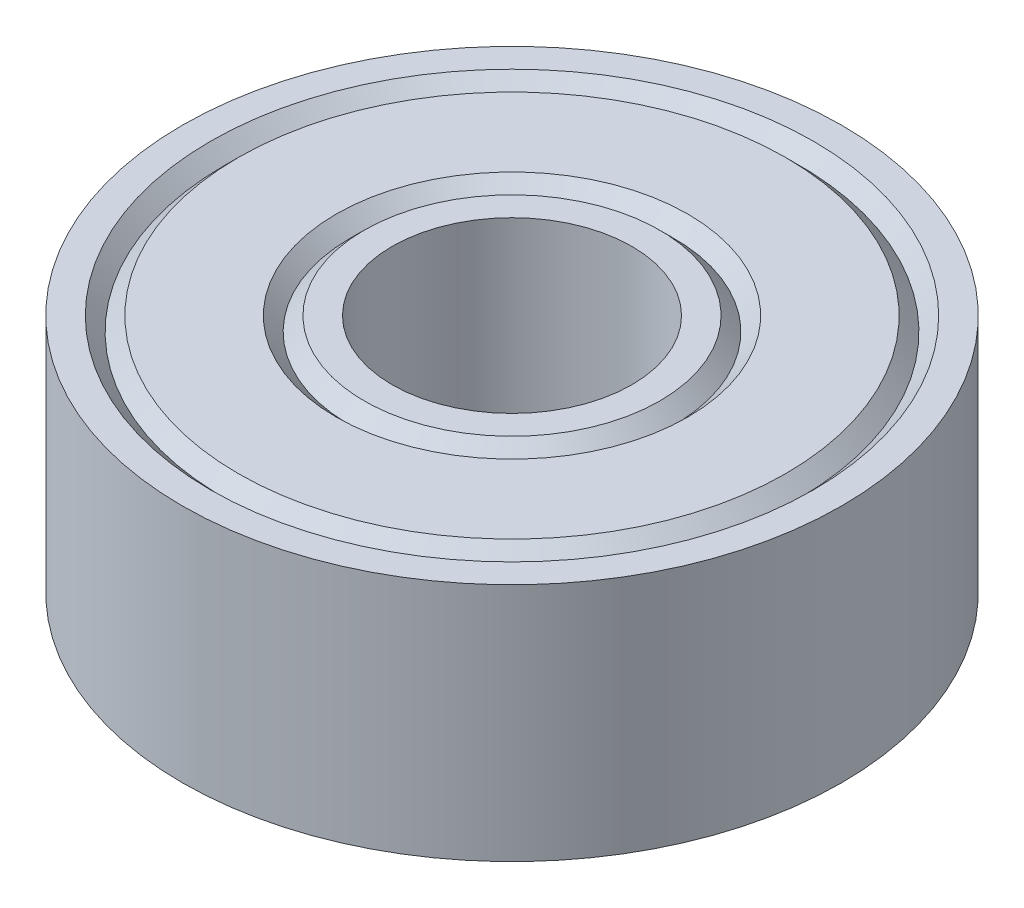
ISO-10303-21;
HEADER;
FILE_DESCRIPTION(('STEP AP214'),'2;1');
FILE_NAME('part.step','',(''),(''),'','','');
FILE_SCHEMA(('AUTOMOTIVE_DESIGN { 1 0 10303 214 1 1 1 1 }'));
ENDSEC;
DATA;
#1=APPLICATION_CONTEXT('core data for automotive mechanical design processes');
#2=APPLICATION_PROTOCOL_DEFINITION('international standard','automotive_design',2000,#1);
#3=PRODUCT_CONTEXT('',#1,'mechanical');
#4=PRODUCT('Part','Part','',(#3));
#5=PRODUCT_RELATED_PRODUCT_CATEGORY('part','',(#4));
#6=PRODUCT_DEFINITION_FORMATION('','',#4);
#7=PRODUCT_DEFINITION_CONTEXT('part definition',#1,'design');
#8=PRODUCT_DEFINITION('design','',#6,#7);
#9=PRODUCT_DEFINITION_SHAPE('','',#8);
#10=(LENGTH_UNIT() NAMED_UNIT(*) SI_UNIT(.MILLI.,.METRE.));
#11=(NAMED_UNIT(*) PLANE_ANGLE_UNIT() SI_UNIT($,.RADIAN.));
#12=(NAMED_UNIT(*) SI_UNIT($,.STERADIAN.) SOLID_ANGLE_UNIT());
#13=UNCERTAINTY_MEASURE_WITH_UNIT(LENGTH_MEASURE(1.E-05),#10,'distance_accuracy_value','');
#14=(GEOMETRIC_REPRESENTATION_CONTEXT(3) GLOBAL_UNCERTAINTY_ASSIGNED_CONTEXT((#13)) GLOBAL_UNIT_ASSIGNED_CONTEXT((#10,
#11,#12)) REPRESENTATION_CONTEXT('',''));
#15=CARTESIAN_POINT('',(0.,0.,0.));
#16=DIRECTION('',(0.,0.,1.));
#17=DIRECTION('',(1.,0.,0.));
#18=AXIS2_PLACEMENT_3D('',#15,#16,#17);
#19=CARTESIAN_POINT('',(0.,2.,0.));
#20=DIRECTION('',(0.,1.,0.));
#21=DIRECTION('',(-1.,0.,0.));
#22=AXIS2_PLACEMENT_3D('',#19,#20,#21);
#23=CYLINDRICAL_SURFACE('',#22,2.);
#24=CARTESIAN_POINT('',(0.,2.,0.));
#25=DIRECTION('',(0.,1.,0.));
#26=DIRECTION('',(-1.,0.,0.));
#27=AXIS2_PLACEMENT_3D('',#24,#25,#26);
#28=CIRCLE('',#27,2.);
#29=CARTESIAN_POINT('',(-2.,2.,0.));
#30=VERTEX_POINT('',#29);
#31=EDGE_CURVE('E83',#30,#30,#28,.T.);
#32=ORIENTED_EDGE('',*,*,#31,.T.);
#33=EDGE_LOOP('',(#32));
#34=FACE_BOUND('',#33,.T.);
#35=CARTESIAN_POINT('',(0.,-2.,0.));
#36=DIRECTION('',(0.,1.,0.));
#37=DIRECTION('',(-1.,0.,0.));
#38=AXIS2_PLACEMENT_3D('',#35,#36,#37);
#39=CIRCLE('',#38,2.);
#40=CARTESIAN_POINT('',(-2.,-2.,0.));
#41=VERTEX_POINT('',#40);
#42=EDGE_CURVE('E10',#41,#41,#39,.T.);
#43=ORIENTED_EDGE('',*,*,#42,.F.);
#44=EDGE_LOOP('',(#43));
#45=FACE_BOUND('',#44,.T.);
#46=ADVANCED_FACE('F31',(#34,#45),#23,.F.);
#47=CARTESIAN_POINT('',(-2.,-2.,0.));
#48=DIRECTION('',(0.,-1.,0.));
#49=DIRECTION('',(1.,0.,0.));
#50=AXIS2_PLACEMENT_3D('',#47,#48,#49);
#51=PLANE('',#50);
#52=ORIENTED_EDGE('',*,*,#42,.T.);
#53=EDGE_LOOP('',(#52));
#54=FACE_BOUND('',#53,.T.);
#55=CARTESIAN_POINT('',(0.,-2.,0.));
#56=DIRECTION('',(0.,1.,0.));
#57=DIRECTION('',(-1.,0.,0.));
#58=AXIS2_PLACEMENT_3D('',#55,#56,#57);
#59=CIRCLE('',#58,2.46666666666666);
#60=CARTESIAN_POINT('',(-2.46666666666667,-2.,0.));
#61=VERTEX_POINT('',#60);
#62=EDGE_CURVE('E37',#61,#61,#59,.T.);
#63=ORIENTED_EDGE('',*,*,#62,.F.);
#64=EDGE_LOOP('',(#63));
#65=FACE_BOUND('',#64,.T.);
#66=ADVANCED_FACE('F101',(#54,#65),#51,.T.);
#67=CARTESIAN_POINT('',(0.,-1.76666666666667,0.));
#68=DIRECTION('',(0.,1.,0.));
#69=DIRECTION('',(-1.,0.,0.));
#70=AXIS2_PLACEMENT_3D('',#67,#68,#69);
#71=CONICAL_SURFACE('',#70,2.7,0.785398163397452);
#72=ORIENTED_EDGE('',*,*,#62,.T.);
#73=EDGE_LOOP('',(#72));
#74=FACE_BOUND('',#73,.T.);
#75=CARTESIAN_POINT('',(0.,-1.76666666666667,0.));
#76=DIRECTION('',(0.,1.,0.));
#77=DIRECTION('',(-1.,0.,0.));
#78=AXIS2_PLACEMENT_3D('',#75,#76,#77);
#79=CIRCLE('',#78,2.7);
#80=CARTESIAN_POINT('',(-2.7,-1.76666666666667,0.));
#81=VERTEX_POINT('',#80);
#82=EDGE_CURVE('E41',#81,#81,#79,.T.);
#83=ORIENTED_EDGE('',*,*,#82,.F.);
#84=EDGE_LOOP('',(#83));
#85=FACE_BOUND('',#84,.T.);
#86=ADVANCED_FACE('F105',(#74,#85),#71,.T.);
#87=CARTESIAN_POINT('',(0.,-2.,0.));
#88=DIRECTION('',(0.,-1.,0.));
#89=DIRECTION('',(1.,0.,0.));
#90=AXIS2_PLACEMENT_3D('',#87,#88,#89);
#91=CONICAL_SURFACE('',#90,2.93333333333333,0.785398163397449);
#92=ORIENTED_EDGE('',*,*,#82,.T.);
#93=EDGE_LOOP('',(#92));
#94=FACE_BOUND('',#93,.T.);
#95=CARTESIAN_POINT('',(0.,-2.,0.));
#96=DIRECTION('',(0.,1.,0.));
#97=DIRECTION('',(-1.,0.,0.));
#98=AXIS2_PLACEMENT_3D('',#95,#96,#97);
#99=CIRCLE('',#98,2.93333333333333);
#100=CARTESIAN_POINT('',(-2.93333333333333,-2.,0.));
#101=VERTEX_POINT('',#100);
#102=EDGE_CURVE('E45',#101,#101,#99,.T.);
#103=ORIENTED_EDGE('',*,*,#102,.F.);
#104=EDGE_LOOP('',(#103));
#105=FACE_BOUND('',#104,.T.);
#106=ADVANCED_FACE('F109',(#94,#105),#91,.F.);
#107=CARTESIAN_POINT('',(-2.93333333333333,-2.,0.));
#108=DIRECTION('',(0.,-1.,0.));
#109=DIRECTION('',(1.,0.,0.));
#110=AXIS2_PLACEMENT_3D('',#107,#108,#109);
#111=PLANE('',#110);
#112=ORIENTED_EDGE('',*,*,#102,.T.);
#113=EDGE_LOOP('',(#112));
#114=FACE_BOUND('',#113,.T.);
#115=CARTESIAN_POINT('',(0.,-2.,0.));
#116=DIRECTION('',(0.,1.,0.));
#117=DIRECTION('',(-1.,0.,0.));
#118=AXIS2_PLACEMENT_3D('',#115,#116,#117);
#119=CIRCLE('',#118,4.56666666666667);
#120=CARTESIAN_POINT('',(-4.56666666666667,-2.,0.));
#121=VERTEX_POINT('',#120);
#122=EDGE_CURVE('E50',#121,#121,#119,.T.);
#123=ORIENTED_EDGE('',*,*,#122,.F.);
#124=EDGE_LOOP('',(#123));
#125=FACE_BOUND('',#124,.T.);
#126=ADVANCED_FACE('F115',(#114,#125),#111,.T.);
#127=CARTESIAN_POINT('',(0.,-1.76666666666667,0.));
#128=DIRECTION('',(0.,1.,0.));
#129=DIRECTION('',(-1.,0.,0.));
#130=AXIS2_PLACEMENT_3D('',#127,#128,#129);
#131=CONICAL_SURFACE('',#130,4.8,0.78539816339745);
#132=ORIENTED_EDGE('',*,*,#122,.T.);
#133=EDGE_LOOP('',(#132));
#134=FACE_BOUND('',#133,.T.);
#135=CARTESIAN_POINT('',(0.,-1.76666666666667,0.));
#136=DIRECTION('',(0.,1.,0.));
#137=DIRECTION('',(-1.,0.,0.));
#138=AXIS2_PLACEMENT_3D('',#135,#136,#137);
#139=CIRCLE('',#138,4.8);
#140=CARTESIAN_POINT('',(-4.8,-1.76666666666667,0.));
#141=VERTEX_POINT('',#140);
#142=EDGE_CURVE('E53',#141,#141,#139,.T.);
#143=ORIENTED_EDGE('',*,*,#142,.F.);
#144=EDGE_LOOP('',(#143));
#145=FACE_BOUND('',#144,.T.);
#146=ADVANCED_FACE('F119',(#134,#145),#131,.T.);
#147=CARTESIAN_POINT('',(0.,-2.,0.));
#148=DIRECTION('',(0.,-1.,0.));
#149=DIRECTION('',(1.,0.,0.));
#150=AXIS2_PLACEMENT_3D('',#147,#148,#149);
#151=CONICAL_SURFACE('',#150,5.03333333333333,0.785398163397447);
#152=ORIENTED_EDGE('',*,*,#142,.T.);
#153=EDGE_LOOP('',(#152));
#154=FACE_BOUND('',#153,.T.);
#155=CARTESIAN_POINT('',(0.,-2.,0.));
#156=DIRECTION('',(0.,1.,0.));
#157=DIRECTION('',(-1.,0.,0.));
#158=AXIS2_PLACEMENT_3D('',#155,#156,#157);
#159=CIRCLE('',#158,5.03333333333333);
#160=CARTESIAN_POINT('',(-5.03333333333333,-2.,0.));
#161=VERTEX_POINT('',#160);
#162=EDGE_CURVE('E56',#161,#161,#159,.T.);
#163=ORIENTED_EDGE('',*,*,#162,.F.);
#164=EDGE_LOOP('',(#163));
#165=FACE_BOUND('',#164,.T.);
#166=ADVANCED_FACE('F123',(#154,#165),#151,.F.);
#167=CARTESIAN_POINT('',(-5.03333333333333,-2.,0.));
#168=DIRECTION('',(0.,-1.,0.));
#169=DIRECTION('',(1.,0.,0.));
#170=AXIS2_PLACEMENT_3D('',#167,#168,#169);
#171=PLANE('',#170);
#172=ORIENTED_EDGE('',*,*,#162,.T.);
#173=EDGE_LOOP('',(#172));
#174=FACE_BOUND('',#173,.T.);
#175=CARTESIAN_POINT('',(0.,-2.,0.));
#176=DIRECTION('',(0.,1.,0.));
#177=DIRECTION('',(-1.,0.,0.));
#178=AXIS2_PLACEMENT_3D('',#175,#176,#177);
#179=CIRCLE('',#178,5.5);
#180=CARTESIAN_POINT('',(-5.5,-2.,0.));
#181=VERTEX_POINT('',#180);
#182=EDGE_CURVE('E59',#181,#181,#179,.T.);
#183=ORIENTED_EDGE('',*,*,#182,.F.);
#184=EDGE_LOOP('',(#183));
#185=FACE_BOUND('',#184,.T.);
#186=ADVANCED_FACE('F127',(#174,#185),#171,.T.);
#187=CARTESIAN_POINT('',(0.,2.,0.));
#188=DIRECTION('',(0.,1.,0.));
#189=DIRECTION('',(-1.,0.,0.));
#190=AXIS2_PLACEMENT_3D('',#187,#188,#189);
#191=CYLINDRICAL_SURFACE('',#190,5.5);
#192=ORIENTED_EDGE('',*,*,#182,.T.);
#193=EDGE_LOOP('',(#192));
#194=FACE_BOUND('',#193,.T.);
#195=CARTESIAN_POINT('',(0.,2.,0.));
#196=DIRECTION('',(0.,1.,0.));
#197=DIRECTION('',(-1.,0.,0.));
#198=AXIS2_PLACEMENT_3D('',#195,#196,#197);
#199=CIRCLE('',#198,5.5);
#200=CARTESIAN_POINT('',(-5.5,2.,0.));
#201=VERTEX_POINT('',#200);
#202=EDGE_CURVE('E62',#201,#201,#199,.T.);
#203=ORIENTED_EDGE('',*,*,#202,.F.);
#204=EDGE_LOOP('',(#203));
#205=FACE_BOUND('',#204,.T.);
#206=ADVANCED_FACE('F131',(#194,#205),#191,.T.);
#207=CARTESIAN_POINT('',(-5.03333333333333,2.,0.));
#208=DIRECTION('',(0.,1.,0.));
#209=DIRECTION('',(-1.,0.,0.));
#210=AXIS2_PLACEMENT_3D('',#207,#208,#209);
#211=PLANE('',#210);
#212=ORIENTED_EDGE('',*,*,#202,.T.);
#213=EDGE_LOOP('',(#212));
#214=FACE_BOUND('',#213,.T.);
#215=CARTESIAN_POINT('',(0.,2.,0.));
#216=DIRECTION('',(0.,1.,0.));
#217=DIRECTION('',(-1.,0.,0.));
#218=AXIS2_PLACEMENT_3D('',#215,#216,#217);
#219=CIRCLE('',#218,5.03333333333333);
#220=CARTESIAN_POINT('',(-5.03333333333333,2.,0.));
#221=VERTEX_POINT('',#220);
#222=EDGE_CURVE('E65',#221,#221,#219,.T.);
#223=ORIENTED_EDGE('',*,*,#222,.F.);
#224=EDGE_LOOP('',(#223));
#225=FACE_BOUND('',#224,.T.);
#226=ADVANCED_FACE('F135',(#214,#225),#211,.T.);
#227=CARTESIAN_POINT('',(0.,1.76666666666667,0.));
#228=DIRECTION('',(0.,1.,0.));
#229=DIRECTION('',(-1.,0.,0.));
#230=AXIS2_PLACEMENT_3D('',#227,#228,#229);
#231=CONICAL_SURFACE('',#230,4.8,0.78539816339745);
#232=ORIENTED_EDGE('',*,*,#222,.T.);
#233=EDGE_LOOP('',(#232));
#234=FACE_BOUND('',#233,.T.);
#235=CARTESIAN_POINT('',(0.,1.76666666666667,0.));
#236=DIRECTION('',(0.,1.,0.));
#237=DIRECTION('',(-1.,0.,0.));
#238=AXIS2_PLACEMENT_3D('',#235,#236,#237);
#239=CIRCLE('',#238,4.8);
#240=CARTESIAN_POINT('',(-4.8,1.76666666666667,0.));
#241=VERTEX_POINT('',#240);
#242=EDGE_CURVE('E68',#241,#241,#239,.T.);
#243=ORIENTED_EDGE('',*,*,#242,.F.);
#244=EDGE_LOOP('',(#243));
#245=FACE_BOUND('',#244,.T.);
#246=ADVANCED_FACE('F139',(#234,#245),#231,.F.);
#247=CARTESIAN_POINT('',(0.,2.,0.));
#248=DIRECTION('',(0.,-1.,0.));
#249=DIRECTION('',(1.,0.,0.));
#250=AXIS2_PLACEMENT_3D('',#247,#248,#249);
#251=CONICAL_SURFACE('',#250,4.56666666666667,0.785398163397448);
#252=ORIENTED_EDGE('',*,*,#242,.T.);
#253=EDGE_LOOP('',(#252));
#254=FACE_BOUND('',#253,.T.);
#255=CARTESIAN_POINT('',(0.,2.,0.));
#256=DIRECTION('',(0.,1.,0.));
#257=DIRECTION('',(-1.,0.,0.));
#258=AXIS2_PLACEMENT_3D('',#255,#256,#257);
#259=CIRCLE('',#258,4.56666666666667);
#260=CARTESIAN_POINT('',(-4.56666666666667,2.,0.));
#261=VERTEX_POINT('',#260);
#262=EDGE_CURVE('E71',#261,#261,#259,.T.);
#263=ORIENTED_EDGE('',*,*,#262,.F.);
#264=EDGE_LOOP('',(#263));
#265=FACE_BOUND('',#264,.T.);
#266=ADVANCED_FACE('F143',(#254,#265),#251,.T.);
#267=CARTESIAN_POINT('',(-2.93333333333333,2.,0.));
#268=DIRECTION('',(0.,1.,0.));
#269=DIRECTION('',(-1.,0.,0.));
#270=AXIS2_PLACEMENT_3D('',#267,#268,#269);
#271=PLANE('',#270);
#272=ORIENTED_EDGE('',*,*,#262,.T.);
#273=EDGE_LOOP('',(#272));
#274=FACE_BOUND('',#273,.T.);
#275=CARTESIAN_POINT('',(0.,2.,0.));
#276=DIRECTION('',(0.,1.,0.));
#277=DIRECTION('',(-1.,0.,0.));
#278=AXIS2_PLACEMENT_3D('',#275,#276,#277);
#279=CIRCLE('',#278,2.93333333333333);
#280=CARTESIAN_POINT('',(-2.93333333333333,2.,0.));
#281=VERTEX_POINT('',#280);
#282=EDGE_CURVE('E74',#281,#281,#279,.T.);
#283=ORIENTED_EDGE('',*,*,#282,.F.);
#284=EDGE_LOOP('',(#283));
#285=FACE_BOUND('',#284,.T.);
#286=ADVANCED_FACE('F147',(#274,#285),#271,.T.);
#287=CARTESIAN_POINT('',(0.,1.76666666666667,0.));
#288=DIRECTION('',(0.,1.,0.));
#289=DIRECTION('',(-1.,0.,0.));
#290=AXIS2_PLACEMENT_3D('',#287,#288,#289);
#291=CONICAL_SURFACE('',#290,2.7,0.785398163397449);
#292=ORIENTED_EDGE('',*,*,#282,.T.);
#293=EDGE_LOOP('',(#292));
#294=FACE_BOUND('',#293,.T.);
#295=CARTESIAN_POINT('',(0.,1.76666666666667,0.));
#296=DIRECTION('',(0.,1.,0.));
#297=DIRECTION('',(-1.,0.,0.));
#298=AXIS2_PLACEMENT_3D('',#295,#296,#297);
#299=CIRCLE('',#298,2.7);
#300=CARTESIAN_POINT('',(-2.7,1.76666666666667,0.));
#301=VERTEX_POINT('',#300);
#302=EDGE_CURVE('E77',#301,#301,#299,.T.);
#303=ORIENTED_EDGE('',*,*,#302,.F.);
#304=EDGE_LOOP('',(#303));
#305=FACE_BOUND('',#304,.T.);
#306=ADVANCED_FACE('F97',(#294,#305),#291,.F.);
#307=CARTESIAN_POINT('',(0.,2.,0.));
#308=DIRECTION('',(0.,-1.,0.));
#309=DIRECTION('',(1.,0.,0.));
#310=AXIS2_PLACEMENT_3D('',#307,#308,#309);
#311=CONICAL_SURFACE('',#310,2.46666666666667,0.785398163397448);
#312=ORIENTED_EDGE('',*,*,#302,.T.);
#313=EDGE_LOOP('',(#312));
#314=FACE_BOUND('',#313,.T.);
#315=CARTESIAN_POINT('',(0.,2.,0.));
#316=DIRECTION('',(0.,1.,0.));
#317=DIRECTION('',(-1.,0.,0.));
#318=AXIS2_PLACEMENT_3D('',#315,#316,#317);
#319=CIRCLE('',#318,2.46666666666667);
#320=CARTESIAN_POINT('',(-2.46666666666667,2.,0.));
#321=VERTEX_POINT('',#320);
#322=EDGE_CURVE('E80',#321,#321,#319,.T.);
#323=ORIENTED_EDGE('',*,*,#322,.F.);
#324=EDGE_LOOP('',(#323));
#325=FACE_BOUND('',#324,.T.);
#326=ADVANCED_FACE('F91',(#314,#325),#311,.T.);
#327=CARTESIAN_POINT('',(-2.,2.,0.));
#328=DIRECTION('',(0.,1.,0.));
#329=DIRECTION('',(-1.,0.,0.));
#330=AXIS2_PLACEMENT_3D('',#327,#328,#329);
#331=PLANE('',#330);
#332=ORIENTED_EDGE('',*,*,#322,.T.);
#333=EDGE_LOOP('',(#332));
#334=FACE_BOUND('',#333,.T.);
#335=ORIENTED_EDGE('',*,*,#31,.F.);
#336=EDGE_LOOP('',(#335));
#337=FACE_BOUND('',#336,.T.);
#338=ADVANCED_FACE('F89',(#334,#337),#331,.T.);
#339=CLOSED_SHELL('',(#46,#66,#86,#106,#126,#146,#166,#186,#206,#226,#246,#266,#286,#306,#326,#338));
#340=MANIFOLD_SOLID_BREP('B2',#339);
#341=ADVANCED_BREP_SHAPE_REPRESENTATION('',(#18,#340),#14);
#342=SHAPE_DEFINITION_REPRESENTATION(#9,#341);
ENDSEC;
END-ISO-10303-21;
